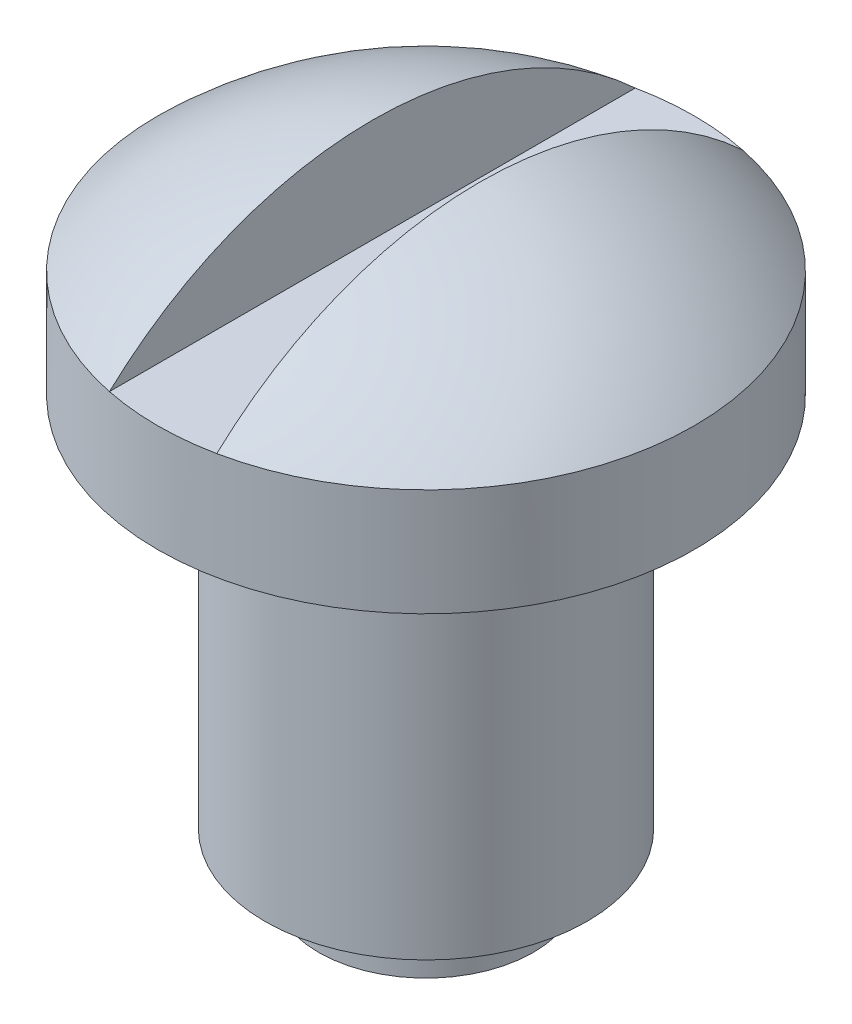
ISO-10303-21;
HEADER;
FILE_DESCRIPTION(('STEP AP214'),'2;1');
FILE_NAME('part.step','',(''),(''),'','','');
FILE_SCHEMA(('AUTOMOTIVE_DESIGN { 1 0 10303 214 1 1 1 1 }'));
ENDSEC;
DATA;
#1=APPLICATION_CONTEXT('core data for automotive mechanical design processes');
#2=APPLICATION_PROTOCOL_DEFINITION('international standard','automotive_design',2000,#1);
#3=PRODUCT_CONTEXT('',#1,'mechanical');
#4=PRODUCT('Part','Part','',(#3));
#5=PRODUCT_RELATED_PRODUCT_CATEGORY('part','',(#4));
#6=PRODUCT_DEFINITION_FORMATION('','',#4);
#7=PRODUCT_DEFINITION_CONTEXT('part definition',#1,'design');
#8=PRODUCT_DEFINITION('design','',#6,#7);
#9=PRODUCT_DEFINITION_SHAPE('','',#8);
#10=(LENGTH_UNIT() NAMED_UNIT(*) SI_UNIT(.MILLI.,.METRE.));
#11=(NAMED_UNIT(*) PLANE_ANGLE_UNIT() SI_UNIT($,.RADIAN.));
#12=(NAMED_UNIT(*) SI_UNIT($,.STERADIAN.) SOLID_ANGLE_UNIT());
#13=UNCERTAINTY_MEASURE_WITH_UNIT(LENGTH_MEASURE(1.E-05),#10,'distance_accuracy_value','');
#14=(GEOMETRIC_REPRESENTATION_CONTEXT(3) GLOBAL_UNCERTAINTY_ASSIGNED_CONTEXT((#13)) GLOBAL_UNIT_ASSIGNED_CONTEXT((#10,
#11,#12)) REPRESENTATION_CONTEXT('',''));
#15=CARTESIAN_POINT('',(0.,0.,0.));
#16=DIRECTION('',(0.,0.,1.));
#17=DIRECTION('',(1.,0.,0.));
#18=AXIS2_PLACEMENT_3D('',#15,#16,#17);
#19=CARTESIAN_POINT('',(0.,4.75,0.));
#20=DIRECTION('',(0.,0.,1.));
#21=DIRECTION('',(1.,0.,0.));
#22=AXIS2_PLACEMENT_3D('',#19,#20,#21);
#23=SPHERICAL_SURFACE('',#22,7.25);
#24=CARTESIAN_POINT('',(1.,4.75,0.));
#25=DIRECTION('',(-1.,0.,0.));
#26=DIRECTION('',(0.,0.,1.));
#27=AXIS2_PLACEMENT_3D('',#24,#25,#26);
#28=CIRCLE('',#27,7.18070330817253);
#29=CARTESIAN_POINT('',(1.,10.,4.89897948556636));
#30=VERTEX_POINT('',#29);
#31=CARTESIAN_POINT('',(0.999999999999999,10.,-4.89897948556636));
#32=VERTEX_POINT('',#31);
#33=EDGE_CURVE('E11',#30,#32,#28,.T.);
#34=ORIENTED_EDGE('',*,*,#33,.F.);
#35=CARTESIAN_POINT('',(0.,10.,0.));
#36=DIRECTION('',(0.,-1.,0.));
#37=DIRECTION('',(0.,0.,-1.));
#38=AXIS2_PLACEMENT_3D('',#35,#36,#37);
#39=CIRCLE('',#38,5.);
#40=EDGE_CURVE('E65',#32,#30,#39,.T.);
#41=ORIENTED_EDGE('',*,*,#40,.F.);
#42=EDGE_LOOP('',(#34,#41));
#43=FACE_BOUND('',#42,.T.);
#44=ADVANCED_FACE('F34',(#43),#23,.T.);
#45=CARTESIAN_POINT('',(-1.,4.75,0.));
#46=DIRECTION('',(1.,0.,0.));
#47=DIRECTION('',(0.,0.,-1.));
#48=AXIS2_PLACEMENT_3D('',#45,#46,#47);
#49=CIRCLE('',#48,7.18070330817253);
#50=CARTESIAN_POINT('',(-1.,10.,-4.89897948556636));
#51=VERTEX_POINT('',#50);
#52=CARTESIAN_POINT('',(-1.,10.,4.89897948556636));
#53=VERTEX_POINT('',#52);
#54=EDGE_CURVE('E41',#51,#53,#49,.T.);
#55=ORIENTED_EDGE('',*,*,#54,.F.);
#56=EDGE_CURVE('E66',#53,#51,#39,.T.);
#57=ORIENTED_EDGE('',*,*,#56,.F.);
#58=EDGE_LOOP('',(#55,#57));
#59=FACE_BOUND('',#58,.T.);
#60=ADVANCED_FACE('F121',(#59),#23,.T.);
#61=CARTESIAN_POINT('',(0.,0.,0.));
#62=DIRECTION('',(0.,-1.,0.));
#63=DIRECTION('',(0.,0.,-1.));
#64=AXIS2_PLACEMENT_3D('',#61,#62,#63);
#65=CYLINDRICAL_SURFACE('',#64,5.);
#66=CARTESIAN_POINT('',(0.,8.,0.));
#67=DIRECTION('',(0.,-1.,0.));
#68=DIRECTION('',(0.,0.,-1.));
#69=AXIS2_PLACEMENT_3D('',#66,#67,#68);
#70=CIRCLE('',#69,5.);
#71=CARTESIAN_POINT('',(0.,8.,-5.));
#72=VERTEX_POINT('',#71);
#73=EDGE_CURVE('E76',#72,#72,#70,.T.);
#74=ORIENTED_EDGE('',*,*,#73,.F.);
#75=EDGE_LOOP('',(#74));
#76=FACE_BOUND('',#75,.T.);
#77=ORIENTED_EDGE('',*,*,#40,.T.);
#78=EDGE_CURVE('E58',#30,#53,#39,.T.);
#79=ORIENTED_EDGE('',*,*,#78,.T.);
#80=ORIENTED_EDGE('',*,*,#56,.T.);
#81=EDGE_CURVE('E53',#51,#32,#39,.T.);
#82=ORIENTED_EDGE('',*,*,#81,.T.);
#83=EDGE_LOOP('',(#77,#79,#80,#82));
#84=FACE_BOUND('',#83,.T.);
#85=ADVANCED_FACE('F74',(#76,#84),#65,.T.);
#86=CARTESIAN_POINT('',(-3.,8.,0.));
#87=DIRECTION('',(0.,1.,0.));
#88=DIRECTION('',(0.,0.,1.));
#89=AXIS2_PLACEMENT_3D('',#86,#87,#88);
#90=PLANE('',#89);
#91=CARTESIAN_POINT('',(0.,8.,0.));
#92=DIRECTION('',(0.,-1.,0.));
#93=DIRECTION('',(0.,0.,-1.));
#94=AXIS2_PLACEMENT_3D('',#91,#92,#93);
#95=CIRCLE('',#94,3.);
#96=CARTESIAN_POINT('',(0.,8.,-3.));
#97=VERTEX_POINT('',#96);
#98=EDGE_CURVE('E78',#97,#97,#95,.T.);
#99=ORIENTED_EDGE('',*,*,#98,.F.);
#100=EDGE_LOOP('',(#99));
#101=FACE_BOUND('',#100,.T.);
#102=ORIENTED_EDGE('',*,*,#73,.T.);
#103=EDGE_LOOP('',(#102));
#104=FACE_BOUND('',#103,.T.);
#105=ADVANCED_FACE('F112',(#101,#104),#90,.F.);
#106=CARTESIAN_POINT('',(0.,0.,0.));
#107=DIRECTION('',(0.,-1.,0.));
#108=DIRECTION('',(0.,0.,-1.));
#109=AXIS2_PLACEMENT_3D('',#106,#107,#108);
#110=CYLINDRICAL_SURFACE('',#109,3.);
#111=CARTESIAN_POINT('',(0.,1.,0.));
#112=DIRECTION('',(0.,-1.,0.));
#113=DIRECTION('',(0.,0.,-1.));
#114=AXIS2_PLACEMENT_3D('',#111,#112,#113);
#115=CIRCLE('',#114,3.);
#116=CARTESIAN_POINT('',(0.,1.,-3.));
#117=VERTEX_POINT('',#116);
#118=EDGE_CURVE('E82',#117,#117,#115,.T.);
#119=ORIENTED_EDGE('',*,*,#118,.F.);
#120=EDGE_LOOP('',(#119));
#121=FACE_BOUND('',#120,.T.);
#122=ORIENTED_EDGE('',*,*,#98,.T.);
#123=EDGE_LOOP('',(#122));
#124=FACE_BOUND('',#123,.T.);
#125=ADVANCED_FACE('F106',(#121,#124),#110,.T.);
#126=CARTESIAN_POINT('',(-2.,1.,0.));
#127=DIRECTION('',(0.,1.,0.));
#128=DIRECTION('',(0.,0.,1.));
#129=AXIS2_PLACEMENT_3D('',#126,#127,#128);
#130=PLANE('',#129);
#131=CARTESIAN_POINT('',(0.,1.,0.));
#132=DIRECTION('',(0.,-1.,0.));
#133=DIRECTION('',(0.,0.,-1.));
#134=AXIS2_PLACEMENT_3D('',#131,#132,#133);
#135=CIRCLE('',#134,2.);
#136=CARTESIAN_POINT('',(0.,1.,-2.));
#137=VERTEX_POINT('',#136);
#138=EDGE_CURVE('E87',#137,#137,#135,.T.);
#139=ORIENTED_EDGE('',*,*,#138,.F.);
#140=EDGE_LOOP('',(#139));
#141=FACE_BOUND('',#140,.T.);
#142=ORIENTED_EDGE('',*,*,#118,.T.);
#143=EDGE_LOOP('',(#142));
#144=FACE_BOUND('',#143,.T.);
#145=ADVANCED_FACE('F100',(#141,#144),#130,.F.);
#146=CARTESIAN_POINT('',(0.,0.,0.));
#147=DIRECTION('',(0.,-1.,0.));
#148=DIRECTION('',(0.,0.,-1.));
#149=AXIS2_PLACEMENT_3D('',#146,#147,#148);
#150=CYLINDRICAL_SURFACE('',#149,2.);
#151=CARTESIAN_POINT('',(0.,0.,0.));
#152=DIRECTION('',(0.,-1.,0.));
#153=DIRECTION('',(0.,0.,-1.));
#154=AXIS2_PLACEMENT_3D('',#151,#152,#153);
#155=CIRCLE('',#154,2.);
#156=CARTESIAN_POINT('',(0.,0.,-2.));
#157=VERTEX_POINT('',#156);
#158=EDGE_CURVE('E90',#157,#157,#155,.T.);
#159=ORIENTED_EDGE('',*,*,#158,.F.);
#160=EDGE_LOOP('',(#159));
#161=FACE_BOUND('',#160,.T.);
#162=ORIENTED_EDGE('',*,*,#138,.T.);
#163=EDGE_LOOP('',(#162));
#164=FACE_BOUND('',#163,.T.);
#165=ADVANCED_FACE('F97',(#161,#164),#150,.T.);
#166=CARTESIAN_POINT('',(0.,0.,0.));
#167=DIRECTION('',(0.,1.,0.));
#168=DIRECTION('',(0.,0.,1.));
#169=AXIS2_PLACEMENT_3D('',#166,#167,#168);
#170=PLANE('',#169);
#171=ORIENTED_EDGE('',*,*,#158,.T.);
#172=EDGE_LOOP('',(#171));
#173=FACE_BOUND('',#172,.T.);
#174=ADVANCED_FACE('F95',(#173),#170,.F.);
#175=CARTESIAN_POINT('',(0.999999999999999,12.,-5.6006840220344));
#176=DIRECTION('',(-1.,0.,0.));
#177=DIRECTION('',(0.,0.,1.));
#178=AXIS2_PLACEMENT_3D('',#175,#176,#177);
#179=PLANE('',#178);
#180=ORIENTED_EDGE('',*,*,#33,.T.);
#181=DIRECTION('',(0.,0.,-1.));
#182=VECTOR('',#181,1.);
#183=CARTESIAN_POINT('',(0.999999999999999,10.,-5.6006840220344));
#184=LINE('',#183,#182);
#185=EDGE_CURVE('E61',#30,#32,#184,.T.);
#186=ORIENTED_EDGE('',*,*,#185,.F.);
#187=EDGE_LOOP('',(#180,#186));
#188=FACE_BOUND('',#187,.T.);
#189=ADVANCED_FACE('F70',(#188),#179,.T.);
#190=CARTESIAN_POINT('',(-1.,12.,-5.6006840220344));
#191=DIRECTION('',(1.,0.,0.));
#192=DIRECTION('',(0.,0.,-1.));
#193=AXIS2_PLACEMENT_3D('',#190,#191,#192);
#194=PLANE('',#193);
#195=ORIENTED_EDGE('',*,*,#54,.T.);
#196=DIRECTION('',(0.,0.,1.));
#197=VECTOR('',#196,1.);
#198=CARTESIAN_POINT('',(-1.,10.,-5.6006840220344));
#199=LINE('',#198,#197);
#200=EDGE_CURVE('E48',#51,#53,#199,.T.);
#201=ORIENTED_EDGE('',*,*,#200,.F.);
#202=EDGE_LOOP('',(#195,#201));
#203=FACE_BOUND('',#202,.T.);
#204=ADVANCED_FACE('F133',(#203),#194,.T.);
#205=CARTESIAN_POINT('',(1.,10.,5.6006840220344));
#206=DIRECTION('',(0.,1.,0.));
#207=DIRECTION('',(0.,0.,1.));
#208=AXIS2_PLACEMENT_3D('',#205,#206,#207);
#209=PLANE('',#208);
#210=ORIENTED_EDGE('',*,*,#81,.F.);
#211=ORIENTED_EDGE('',*,*,#200,.T.);
#212=ORIENTED_EDGE('',*,*,#78,.F.);
#213=ORIENTED_EDGE('',*,*,#185,.T.);
#214=EDGE_LOOP('',(#210,#211,#212,#213));
#215=FACE_BOUND('',#214,.T.);
#216=ADVANCED_FACE('F60',(#215),#209,.T.);
#217=CLOSED_SHELL('',(#44,#60,#85,#105,#125,#145,#165,#174,#189,#204,#216));
#218=MANIFOLD_SOLID_BREP('B2',#217);
#219=ADVANCED_BREP_SHAPE_REPRESENTATION('',(#18,#218),#14);
#220=SHAPE_DEFINITION_REPRESENTATION(#9,#219);
ENDSEC;
END-ISO-10303-21;
